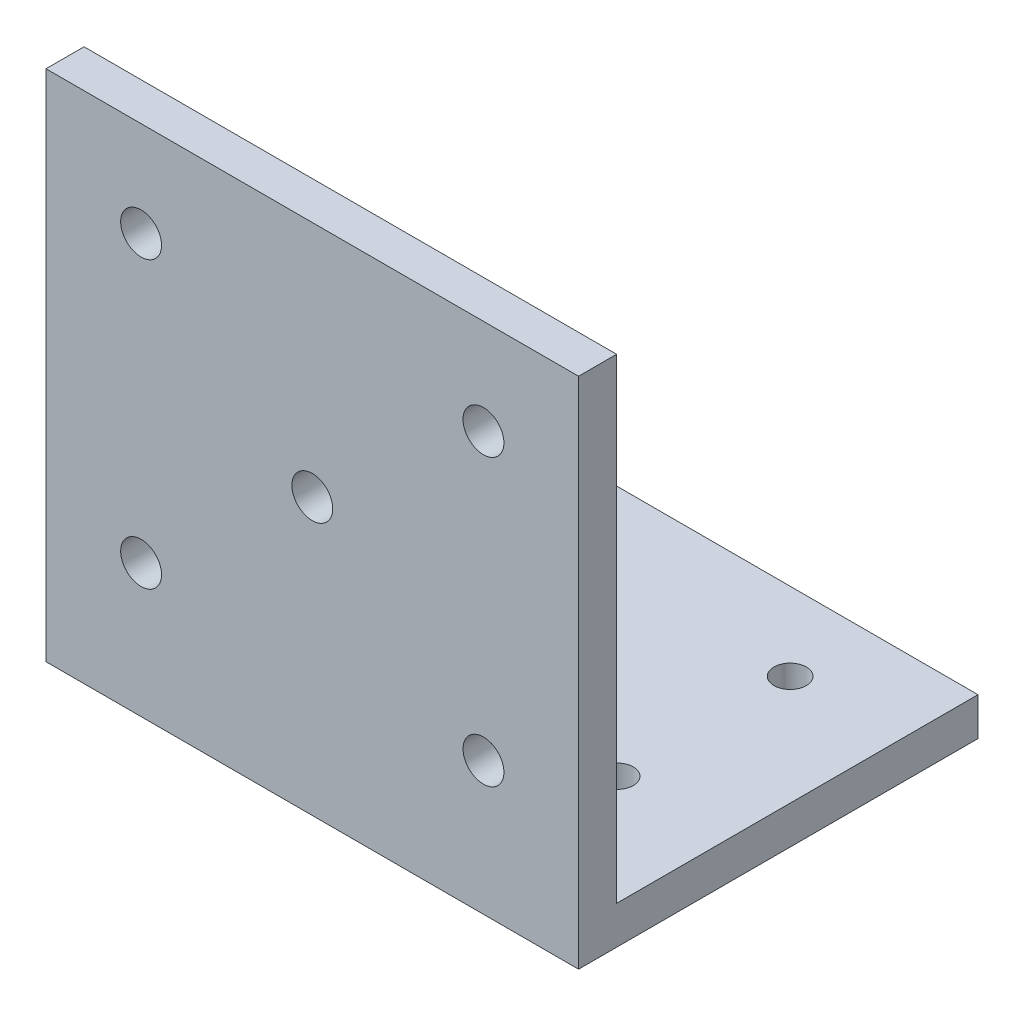
ISO-10303-21;
HEADER;
FILE_DESCRIPTION(('STEP AP214'),'2;1');
FILE_NAME('part.step','',(''),(''),'','','');
FILE_SCHEMA(('AUTOMOTIVE_DESIGN { 1 0 10303 214 1 1 1 1 }'));
ENDSEC;
DATA;
#1=APPLICATION_CONTEXT('core data for automotive mechanical design processes');
#2=APPLICATION_PROTOCOL_DEFINITION('international standard','automotive_design',2000,#1);
#3=PRODUCT_CONTEXT('',#1,'mechanical');
#4=PRODUCT('Part','Part','',(#3));
#5=PRODUCT_RELATED_PRODUCT_CATEGORY('part','',(#4));
#6=PRODUCT_DEFINITION_FORMATION('','',#4);
#7=PRODUCT_DEFINITION_CONTEXT('part definition',#1,'design');
#8=PRODUCT_DEFINITION('design','',#6,#7);
#9=PRODUCT_DEFINITION_SHAPE('','',#8);
#10=(LENGTH_UNIT() NAMED_UNIT(*) SI_UNIT(.MILLI.,.METRE.));
#11=(NAMED_UNIT(*) PLANE_ANGLE_UNIT() SI_UNIT($,.RADIAN.));
#12=(NAMED_UNIT(*) SI_UNIT($,.STERADIAN.) SOLID_ANGLE_UNIT());
#13=UNCERTAINTY_MEASURE_WITH_UNIT(LENGTH_MEASURE(1.E-05),#10,'distance_accuracy_value','');
#14=(GEOMETRIC_REPRESENTATION_CONTEXT(3) GLOBAL_UNCERTAINTY_ASSIGNED_CONTEXT((#13)) GLOBAL_UNIT_ASSIGNED_CONTEXT((#10,
#11,#12)) REPRESENTATION_CONTEXT('',''));
#15=CARTESIAN_POINT('',(0.,0.,0.));
#16=DIRECTION('',(0.,0.,1.));
#17=DIRECTION('',(1.,0.,0.));
#18=AXIS2_PLACEMENT_3D('',#15,#16,#17);
#19=CARTESIAN_POINT('',(0.,0.,0.));
#20=DIRECTION('',(0.,1.,0.));
#21=DIRECTION('',(0.,0.,1.));
#22=AXIS2_PLACEMENT_3D('',#19,#20,#21);
#23=PLANE('',#22);
#24=CARTESIAN_POINT('',(-22.762292358804,0.,-4.59069767441856));
#25=DIRECTION('',(0.,1.,0.));
#26=DIRECTION('',(0.,0.,1.));
#27=AXIS2_PLACEMENT_3D('',#24,#25,#26);
#28=CIRCLE('',#27,1.7);
#29=CARTESIAN_POINT('',(-22.762292358804,0.,-2.89069767441856));
#30=VERTEX_POINT('',#29);
#31=EDGE_CURVE('E285',#30,#30,#28,.T.);
#32=ORIENTED_EDGE('',*,*,#31,.T.);
#33=EDGE_LOOP('',(#32));
#34=FACE_BOUND('',#33,.T.);
#35=CARTESIAN_POINT('',(-14.512292358804,0.,4.50930232558144));
#36=DIRECTION('',(0.,1.,0.));
#37=DIRECTION('',(0.,0.,1.));
#38=AXIS2_PLACEMENT_3D('',#35,#36,#37);
#39=CIRCLE('',#38,7.2);
#40=CARTESIAN_POINT('',(-14.512292358804,0.,11.7093023255814));
#41=VERTEX_POINT('',#40);
#42=EDGE_CURVE('E295',#41,#41,#39,.T.);
#43=ORIENTED_EDGE('',*,*,#42,.T.);
#44=EDGE_LOOP('',(#43));
#45=FACE_BOUND('',#44,.T.);
#46=CARTESIAN_POINT('',(-22.762292358804,0.,13.6093023255814));
#47=DIRECTION('',(0.,1.,0.));
#48=DIRECTION('',(0.,0.,1.));
#49=AXIS2_PLACEMENT_3D('',#46,#47,#48);
#50=CIRCLE('',#49,1.7);
#51=CARTESIAN_POINT('',(-22.762292358804,0.,15.3093023255814));
#52=VERTEX_POINT('',#51);
#53=EDGE_CURVE('E304',#52,#52,#50,.T.);
#54=ORIENTED_EDGE('',*,*,#53,.T.);
#55=EDGE_LOOP('',(#54));
#56=FACE_BOUND('',#55,.T.);
#57=DIRECTION('',(0.,0.,1.));
#58=VECTOR('',#57,1.);
#59=CARTESIAN_POINT('',(21.687707641196,0.,0.));
#60=LINE('',#59,#58);
#61=CARTESIAN_POINT('',(21.687707641196,0.,-12.7906976744186));
#62=VERTEX_POINT('',#61);
#63=CARTESIAN_POINT('',(21.687707641196,0.,29.2093023255814));
#64=VERTEX_POINT('',#63);
#65=EDGE_CURVE('E183',#62,#64,#60,.T.);
#66=ORIENTED_EDGE('',*,*,#65,.T.);
#67=DIRECTION('',(-1.,0.,0.));
#68=VECTOR('',#67,1.);
#69=CARTESIAN_POINT('',(0.,0.,29.2093023255814));
#70=LINE('',#69,#68);
#71=CARTESIAN_POINT('',(-34.312292358804,0.,29.2093023255815));
#72=VERTEX_POINT('',#71);
#73=EDGE_CURVE('E206',#64,#72,#70,.T.);
#74=ORIENTED_EDGE('',*,*,#73,.T.);
#75=DIRECTION('',(0.,0.,-1.));
#76=VECTOR('',#75,1.);
#77=CARTESIAN_POINT('',(-34.312292358804,0.,0.));
#78=LINE('',#77,#76);
#79=CARTESIAN_POINT('',(-34.312292358804,0.,-12.7906976744186));
#80=VERTEX_POINT('',#79);
#81=EDGE_CURVE('E213',#72,#80,#78,.T.);
#82=ORIENTED_EDGE('',*,*,#81,.T.);
#83=DIRECTION('',(1.,0.,0.));
#84=VECTOR('',#83,1.);
#85=CARTESIAN_POINT('',(0.,0.,-12.7906976744186));
#86=LINE('',#85,#84);
#87=EDGE_CURVE('E180',#80,#62,#86,.T.);
#88=ORIENTED_EDGE('',*,*,#87,.T.);
#89=EDGE_LOOP('',(#66,#74,#82,#88));
#90=FACE_BOUND('',#89,.T.);
#91=CARTESIAN_POINT('',(10.137707641196,0.,-4.59069767441856));
#92=DIRECTION('',(0.,1.,0.));
#93=DIRECTION('',(0.,0.,1.));
#94=AXIS2_PLACEMENT_3D('',#91,#92,#93);
#95=CIRCLE('',#94,1.7);
#96=CARTESIAN_POINT('',(10.137707641196,0.,-2.89069767441856));
#97=VERTEX_POINT('',#96);
#98=EDGE_CURVE('E301',#97,#97,#95,.F.);
#99=ORIENTED_EDGE('',*,*,#98,.F.);
#100=EDGE_LOOP('',(#99));
#101=FACE_BOUND('',#100,.T.);
#102=CARTESIAN_POINT('',(10.137707641196,0.,13.6093023255814));
#103=DIRECTION('',(0.,1.,0.));
#104=DIRECTION('',(0.,0.,1.));
#105=AXIS2_PLACEMENT_3D('',#102,#103,#104);
#106=CIRCLE('',#105,1.7);
#107=CARTESIAN_POINT('',(10.137707641196,0.,15.3093023255814));
#108=VERTEX_POINT('',#107);
#109=EDGE_CURVE('E298',#108,#108,#106,.F.);
#110=ORIENTED_EDGE('',*,*,#109,.F.);
#111=EDGE_LOOP('',(#110));
#112=FACE_BOUND('',#111,.T.);
#113=ADVANCED_FACE('F114',(#34,#45,#56,#90,#101,#112),#23,.F.);
#114=CARTESIAN_POINT('',(0.,4.,0.));
#115=DIRECTION('',(0.,1.,0.));
#116=DIRECTION('',(0.,0.,1.));
#117=AXIS2_PLACEMENT_3D('',#114,#115,#116);
#118=PLANE('',#117);
#119=CARTESIAN_POINT('',(-22.762292358804,4.,-4.59069767441856));
#120=DIRECTION('',(0.,1.,0.));
#121=DIRECTION('',(0.,0.,1.));
#122=AXIS2_PLACEMENT_3D('',#119,#120,#121);
#123=CIRCLE('',#122,1.7);
#124=CARTESIAN_POINT('',(-22.762292358804,4.,-2.89069767441856));
#125=VERTEX_POINT('',#124);
#126=EDGE_CURVE('E311',#125,#125,#123,.T.);
#127=ORIENTED_EDGE('',*,*,#126,.F.);
#128=EDGE_LOOP('',(#127));
#129=FACE_BOUND('',#128,.T.);
#130=CARTESIAN_POINT('',(-14.512292358804,4.,4.50930232558144));
#131=DIRECTION('',(0.,1.,0.));
#132=DIRECTION('',(0.,0.,1.));
#133=AXIS2_PLACEMENT_3D('',#130,#131,#132);
#134=CIRCLE('',#133,7.2);
#135=CARTESIAN_POINT('',(-14.512292358804,4.,11.7093023255814));
#136=VERTEX_POINT('',#135);
#137=EDGE_CURVE('E314',#136,#136,#134,.T.);
#138=ORIENTED_EDGE('',*,*,#137,.F.);
#139=EDGE_LOOP('',(#138));
#140=FACE_BOUND('',#139,.T.);
#141=CARTESIAN_POINT('',(10.137707641196,4.,-4.59069767441856));
#142=DIRECTION('',(0.,1.,0.));
#143=DIRECTION('',(0.,0.,1.));
#144=AXIS2_PLACEMENT_3D('',#141,#142,#143);
#145=CIRCLE('',#144,1.7);
#146=CARTESIAN_POINT('',(10.137707641196,4.,-2.89069767441856));
#147=VERTEX_POINT('',#146);
#148=EDGE_CURVE('E310',#147,#147,#145,.F.);
#149=ORIENTED_EDGE('',*,*,#148,.T.);
#150=EDGE_LOOP('',(#149));
#151=FACE_BOUND('',#150,.T.);
#152=CARTESIAN_POINT('',(-22.762292358804,4.,13.6093023255814));
#153=DIRECTION('',(0.,1.,0.));
#154=DIRECTION('',(0.,0.,1.));
#155=AXIS2_PLACEMENT_3D('',#152,#153,#154);
#156=CIRCLE('',#155,1.7);
#157=CARTESIAN_POINT('',(-22.762292358804,4.,15.3093023255814));
#158=VERTEX_POINT('',#157);
#159=EDGE_CURVE('E307',#158,#158,#156,.T.);
#160=ORIENTED_EDGE('',*,*,#159,.F.);
#161=EDGE_LOOP('',(#160));
#162=FACE_BOUND('',#161,.T.);
#163=DIRECTION('',(1.,0.,0.));
#164=VECTOR('',#163,1.);
#165=CARTESIAN_POINT('',(0.,4.,-12.7906976744186));
#166=LINE('',#165,#164);
#167=CARTESIAN_POINT('',(-34.312292358804,4.,-12.7906976744186));
#168=VERTEX_POINT('',#167);
#169=CARTESIAN_POINT('',(21.687707641196,4.,-12.7906976744186));
#170=VERTEX_POINT('',#169);
#171=EDGE_CURVE('E177',#168,#170,#166,.T.);
#172=ORIENTED_EDGE('',*,*,#171,.F.);
#173=DIRECTION('',(0.,0.,-1.));
#174=VECTOR('',#173,1.);
#175=CARTESIAN_POINT('',(-34.312292358804,4.,0.));
#176=LINE('',#175,#174);
#177=CARTESIAN_POINT('',(-34.312292358804,4.,25.2093023255815));
#178=VERTEX_POINT('',#177);
#179=EDGE_CURVE('E129',#178,#168,#176,.T.);
#180=ORIENTED_EDGE('',*,*,#179,.F.);
#181=DIRECTION('',(-1.,0.,0.));
#182=VECTOR('',#181,1.);
#183=CARTESIAN_POINT('',(0.,4.,25.2093023255815));
#184=LINE('',#183,#182);
#185=CARTESIAN_POINT('',(21.687707641196,4.,25.2093023255815));
#186=VERTEX_POINT('',#185);
#187=EDGE_CURVE('E194',#186,#178,#184,.T.);
#188=ORIENTED_EDGE('',*,*,#187,.F.);
#189=DIRECTION('',(0.,0.,1.));
#190=VECTOR('',#189,1.);
#191=CARTESIAN_POINT('',(21.687707641196,4.,0.));
#192=LINE('',#191,#190);
#193=EDGE_CURVE('E188',#170,#186,#192,.T.);
#194=ORIENTED_EDGE('',*,*,#193,.F.);
#195=EDGE_LOOP('',(#172,#180,#188,#194));
#196=FACE_BOUND('',#195,.T.);
#197=CARTESIAN_POINT('',(10.137707641196,4.,13.6093023255814));
#198=DIRECTION('',(0.,1.,0.));
#199=DIRECTION('',(0.,0.,1.));
#200=AXIS2_PLACEMENT_3D('',#197,#198,#199);
#201=CIRCLE('',#200,1.7);
#202=CARTESIAN_POINT('',(10.137707641196,4.,15.3093023255814));
#203=VERTEX_POINT('',#202);
#204=EDGE_CURVE('E317',#203,#203,#201,.F.);
#205=ORIENTED_EDGE('',*,*,#204,.T.);
#206=EDGE_LOOP('',(#205));
#207=FACE_BOUND('',#206,.T.);
#208=ADVANCED_FACE('F186',(#129,#140,#151,#162,#196,#207),#118,.T.);
#209=CARTESIAN_POINT('',(0.,54.,25.2093023255815));
#210=DIRECTION('',(0.,0.,1.));
#211=DIRECTION('',(1.,0.,0.));
#212=AXIS2_PLACEMENT_3D('',#209,#210,#211);
#213=PLANE('',#212);
#214=CARTESIAN_POINT('',(-24.312292358804,14.,25.2093023255815));
#215=DIRECTION('',(0.,0.,-1.));
#216=DIRECTION('',(-1.,0.,0.));
#217=AXIS2_PLACEMENT_3D('',#214,#215,#216);
#218=CIRCLE('',#217,2.15);
#219=CARTESIAN_POINT('',(-26.462292358804,14.,25.2093023255815));
#220=VERTEX_POINT('',#219);
#221=EDGE_CURVE('E260',#220,#220,#218,.T.);
#222=ORIENTED_EDGE('',*,*,#221,.F.);
#223=EDGE_LOOP('',(#222));
#224=FACE_BOUND('',#223,.T.);
#225=CARTESIAN_POINT('',(-24.312292358804,44.,25.2093023255815));
#226=DIRECTION('',(0.,0.,1.));
#227=DIRECTION('',(1.,0.,0.));
#228=AXIS2_PLACEMENT_3D('',#225,#226,#227);
#229=CIRCLE('',#228,2.15);
#230=CARTESIAN_POINT('',(-22.162292358804,44.,25.2093023255815));
#231=VERTEX_POINT('',#230);
#232=EDGE_CURVE('E263',#231,#231,#229,.T.);
#233=ORIENTED_EDGE('',*,*,#232,.T.);
#234=EDGE_LOOP('',(#233));
#235=FACE_BOUND('',#234,.T.);
#236=DIRECTION('',(0.,-1.,0.));
#237=VECTOR('',#236,1.);
#238=CARTESIAN_POINT('',(21.687707641196,54.,25.2093023255815));
#239=LINE('',#238,#237);
#240=CARTESIAN_POINT('',(21.687707641196,54.,25.2093023255815));
#241=VERTEX_POINT('',#240);
#242=EDGE_CURVE('E12',#241,#186,#239,.T.);
#243=ORIENTED_EDGE('',*,*,#242,.T.);
#244=ORIENTED_EDGE('',*,*,#187,.T.);
#245=DIRECTION('',(0.,-1.,0.));
#246=VECTOR('',#245,1.);
#247=CARTESIAN_POINT('',(-34.312292358804,54.,25.2093023255815));
#248=LINE('',#247,#246);
#249=CARTESIAN_POINT('',(-34.312292358804,54.,25.2093023255815));
#250=VERTEX_POINT('',#249);
#251=EDGE_CURVE('E122',#250,#178,#248,.T.);
#252=ORIENTED_EDGE('',*,*,#251,.F.);
#253=DIRECTION('',(-1.,0.,0.));
#254=VECTOR('',#253,1.);
#255=CARTESIAN_POINT('',(0.,54.,25.2093023255815));
#256=LINE('',#255,#254);
#257=EDGE_CURVE('E205',#241,#250,#256,.T.);
#258=ORIENTED_EDGE('',*,*,#257,.F.);
#259=EDGE_LOOP('',(#243,#244,#252,#258));
#260=FACE_BOUND('',#259,.T.);
#261=CARTESIAN_POINT('',(11.687707641196,14.,25.2093023255815));
#262=DIRECTION('',(0.,0.,-1.));
#263=DIRECTION('',(-1.,0.,0.));
#264=AXIS2_PLACEMENT_3D('',#261,#262,#263);
#265=CIRCLE('',#264,2.15);
#266=CARTESIAN_POINT('',(9.53770764119601,14.,25.2093023255815));
#267=VERTEX_POINT('',#266);
#268=EDGE_CURVE('E287',#267,#267,#265,.F.);
#269=ORIENTED_EDGE('',*,*,#268,.T.);
#270=EDGE_LOOP('',(#269));
#271=FACE_BOUND('',#270,.T.);
#272=CARTESIAN_POINT('',(11.687707641196,44.,25.2093023255815));
#273=DIRECTION('',(0.,0.,-1.));
#274=DIRECTION('',(-1.,0.,0.));
#275=AXIS2_PLACEMENT_3D('',#272,#273,#274);
#276=CIRCLE('',#275,2.15);
#277=CARTESIAN_POINT('',(9.53770764119601,44.,25.2093023255815));
#278=VERTEX_POINT('',#277);
#279=EDGE_CURVE('E269',#278,#278,#276,.T.);
#280=ORIENTED_EDGE('',*,*,#279,.F.);
#281=EDGE_LOOP('',(#280));
#282=FACE_BOUND('',#281,.T.);
#283=CARTESIAN_POINT('',(-6.31229235880399,29.,25.2093023255815));
#284=DIRECTION('',(0.,0.,-1.));
#285=DIRECTION('',(-1.,0.,0.));
#286=AXIS2_PLACEMENT_3D('',#283,#284,#285);
#287=CIRCLE('',#286,2.15);
#288=CARTESIAN_POINT('',(-8.46229235880399,29.,25.2093023255815));
#289=VERTEX_POINT('',#288);
#290=EDGE_CURVE('E279',#289,#289,#287,.T.);
#291=ORIENTED_EDGE('',*,*,#290,.F.);
#292=EDGE_LOOP('',(#291));
#293=FACE_BOUND('',#292,.T.);
#294=ADVANCED_FACE('F226',(#224,#235,#260,#271,#282,#293),#213,.F.);
#295=CARTESIAN_POINT('',(0.,54.,29.2093023255814));
#296=DIRECTION('',(0.,0.,1.));
#297=DIRECTION('',(1.,0.,0.));
#298=AXIS2_PLACEMENT_3D('',#295,#296,#297);
#299=PLANE('',#298);
#300=CARTESIAN_POINT('',(-24.312292358804,44.,29.2093023255815));
#301=DIRECTION('',(0.,0.,1.));
#302=DIRECTION('',(1.,0.,0.));
#303=AXIS2_PLACEMENT_3D('',#300,#301,#302);
#304=CIRCLE('',#303,2.15);
#305=CARTESIAN_POINT('',(-22.162292358804,44.,29.2093023255815));
#306=VERTEX_POINT('',#305);
#307=EDGE_CURVE('E266',#306,#306,#304,.T.);
#308=ORIENTED_EDGE('',*,*,#307,.F.);
#309=EDGE_LOOP('',(#308));
#310=FACE_BOUND('',#309,.T.);
#311=CARTESIAN_POINT('',(11.687707641196,14.,29.2093023255815));
#312=DIRECTION('',(0.,0.,-1.));
#313=DIRECTION('',(-1.,0.,0.));
#314=AXIS2_PLACEMENT_3D('',#311,#312,#313);
#315=CIRCLE('',#314,2.15);
#316=CARTESIAN_POINT('',(9.53770764119601,14.,29.2093023255815));
#317=VERTEX_POINT('',#316);
#318=EDGE_CURVE('E201',#317,#317,#315,.F.);
#319=ORIENTED_EDGE('',*,*,#318,.F.);
#320=EDGE_LOOP('',(#319));
#321=FACE_BOUND('',#320,.T.);
#322=ORIENTED_EDGE('',*,*,#73,.F.);
#323=DIRECTION('',(0.,-1.,0.));
#324=VECTOR('',#323,1.);
#325=CARTESIAN_POINT('',(21.687707641196,54.,29.2093023255814));
#326=LINE('',#325,#324);
#327=CARTESIAN_POINT('',(21.687707641196,54.,29.2093023255814));
#328=VERTEX_POINT('',#327);
#329=EDGE_CURVE('E138',#328,#64,#326,.T.);
#330=ORIENTED_EDGE('',*,*,#329,.F.);
#331=DIRECTION('',(-1.,0.,0.));
#332=VECTOR('',#331,1.);
#333=CARTESIAN_POINT('',(0.,54.,29.2093023255814));
#334=LINE('',#333,#332);
#335=CARTESIAN_POINT('',(-34.312292358804,54.,29.2093023255815));
#336=VERTEX_POINT('',#335);
#337=EDGE_CURVE('E210',#328,#336,#334,.T.);
#338=ORIENTED_EDGE('',*,*,#337,.T.);
#339=DIRECTION('',(0.,-1.,0.));
#340=VECTOR('',#339,1.);
#341=CARTESIAN_POINT('',(-34.312292358804,54.,29.2093023255815));
#342=LINE('',#341,#340);
#343=EDGE_CURVE('E218',#336,#72,#342,.T.);
#344=ORIENTED_EDGE('',*,*,#343,.T.);
#345=EDGE_LOOP('',(#322,#330,#338,#344));
#346=FACE_BOUND('',#345,.T.);
#347=CARTESIAN_POINT('',(11.687707641196,44.,29.2093023255815));
#348=DIRECTION('',(0.,0.,-1.));
#349=DIRECTION('',(-1.,0.,0.));
#350=AXIS2_PLACEMENT_3D('',#347,#348,#349);
#351=CIRCLE('',#350,2.15);
#352=CARTESIAN_POINT('',(9.53770764119601,44.,29.2093023255815));
#353=VERTEX_POINT('',#352);
#354=EDGE_CURVE('E265',#353,#353,#351,.T.);
#355=ORIENTED_EDGE('',*,*,#354,.T.);
#356=EDGE_LOOP('',(#355));
#357=FACE_BOUND('',#356,.T.);
#358=CARTESIAN_POINT('',(-24.312292358804,14.,29.2093023255815));
#359=DIRECTION('',(0.,0.,-1.));
#360=DIRECTION('',(-1.,0.,0.));
#361=AXIS2_PLACEMENT_3D('',#358,#359,#360);
#362=CIRCLE('',#361,2.15);
#363=CARTESIAN_POINT('',(-26.462292358804,14.,29.2093023255815));
#364=VERTEX_POINT('',#363);
#365=EDGE_CURVE('E276',#364,#364,#362,.T.);
#366=ORIENTED_EDGE('',*,*,#365,.T.);
#367=EDGE_LOOP('',(#366));
#368=FACE_BOUND('',#367,.T.);
#369=CARTESIAN_POINT('',(-6.31229235880399,29.,29.2093023255815));
#370=DIRECTION('',(0.,0.,-1.));
#371=DIRECTION('',(-1.,0.,0.));
#372=AXIS2_PLACEMENT_3D('',#369,#370,#371);
#373=CIRCLE('',#372,2.15);
#374=CARTESIAN_POINT('',(-8.46229235880399,29.,29.2093023255815));
#375=VERTEX_POINT('',#374);
#376=EDGE_CURVE('E282',#375,#375,#373,.T.);
#377=ORIENTED_EDGE('',*,*,#376,.T.);
#378=EDGE_LOOP('',(#377));
#379=FACE_BOUND('',#378,.T.);
#380=ADVANCED_FACE('F219',(#310,#321,#346,#357,#368,#379),#299,.T.);
#381=CARTESIAN_POINT('',(21.687707641196,54.,0.));
#382=DIRECTION('',(1.,0.,0.));
#383=DIRECTION('',(0.,0.,-1.));
#384=AXIS2_PLACEMENT_3D('',#381,#382,#383);
#385=PLANE('',#384);
#386=ORIENTED_EDGE('',*,*,#65,.F.);
#387=DIRECTION('',(0.,-1.,0.));
#388=VECTOR('',#387,1.);
#389=CARTESIAN_POINT('',(21.687707641196,4.,-12.7906976744186));
#390=LINE('',#389,#388);
#391=EDGE_CURVE('E184',#170,#62,#390,.T.);
#392=ORIENTED_EDGE('',*,*,#391,.F.);
#393=ORIENTED_EDGE('',*,*,#193,.T.);
#394=ORIENTED_EDGE('',*,*,#242,.F.);
#395=DIRECTION('',(0.,0.,1.));
#396=VECTOR('',#395,1.);
#397=CARTESIAN_POINT('',(21.687707641196,54.,0.));
#398=LINE('',#397,#396);
#399=EDGE_CURVE('E203',#241,#328,#398,.T.);
#400=ORIENTED_EDGE('',*,*,#399,.T.);
#401=ORIENTED_EDGE('',*,*,#329,.T.);
#402=EDGE_LOOP('',(#386,#392,#393,#394,#400,#401));
#403=FACE_BOUND('',#402,.T.);
#404=ADVANCED_FACE('F116',(#403),#385,.T.);
#405=CARTESIAN_POINT('',(-34.312292358804,54.,0.));
#406=DIRECTION('',(-1.,0.,0.));
#407=DIRECTION('',(0.,0.,1.));
#408=AXIS2_PLACEMENT_3D('',#405,#406,#407);
#409=PLANE('',#408);
#410=ORIENTED_EDGE('',*,*,#81,.F.);
#411=ORIENTED_EDGE('',*,*,#343,.F.);
#412=DIRECTION('',(0.,0.,-1.));
#413=VECTOR('',#412,1.);
#414=CARTESIAN_POINT('',(-34.312292358804,54.,0.));
#415=LINE('',#414,#413);
#416=EDGE_CURVE('E208',#336,#250,#415,.T.);
#417=ORIENTED_EDGE('',*,*,#416,.T.);
#418=ORIENTED_EDGE('',*,*,#251,.T.);
#419=ORIENTED_EDGE('',*,*,#179,.T.);
#420=DIRECTION('',(0.,-1.,0.));
#421=VECTOR('',#420,1.);
#422=CARTESIAN_POINT('',(-34.312292358804,4.,-12.7906976744186));
#423=LINE('',#422,#421);
#424=EDGE_CURVE('E174',#168,#80,#423,.T.);
#425=ORIENTED_EDGE('',*,*,#424,.T.);
#426=EDGE_LOOP('',(#410,#411,#417,#418,#419,#425));
#427=FACE_BOUND('',#426,.T.);
#428=ADVANCED_FACE('F191',(#427),#409,.T.);
#429=CARTESIAN_POINT('',(0.,54.,0.));
#430=DIRECTION('',(0.,1.,0.));
#431=DIRECTION('',(0.,0.,1.));
#432=AXIS2_PLACEMENT_3D('',#429,#430,#431);
#433=PLANE('',#432);
#434=ORIENTED_EDGE('',*,*,#399,.F.);
#435=ORIENTED_EDGE('',*,*,#257,.T.);
#436=ORIENTED_EDGE('',*,*,#416,.F.);
#437=ORIENTED_EDGE('',*,*,#337,.F.);
#438=EDGE_LOOP('',(#434,#435,#436,#437));
#439=FACE_BOUND('',#438,.T.);
#440=ADVANCED_FACE('F230',(#439),#433,.T.);
#441=CARTESIAN_POINT('',(0.,4.,-12.7906976744186));
#442=DIRECTION('',(0.,0.,-1.));
#443=DIRECTION('',(-1.,0.,0.));
#444=AXIS2_PLACEMENT_3D('',#441,#442,#443);
#445=PLANE('',#444);
#446=ORIENTED_EDGE('',*,*,#87,.F.);
#447=ORIENTED_EDGE('',*,*,#424,.F.);
#448=ORIENTED_EDGE('',*,*,#171,.T.);
#449=ORIENTED_EDGE('',*,*,#391,.T.);
#450=EDGE_LOOP('',(#446,#447,#448,#449));
#451=FACE_BOUND('',#450,.T.);
#452=ADVANCED_FACE('F175',(#451),#445,.T.);
#453=CARTESIAN_POINT('',(11.687707641196,14.,29.2093023255815));
#454=DIRECTION('',(0.,0.,-1.));
#455=DIRECTION('',(-1.,0.,0.));
#456=AXIS2_PLACEMENT_3D('',#453,#454,#455);
#457=CYLINDRICAL_SURFACE('',#456,2.15);
#458=ORIENTED_EDGE('',*,*,#318,.T.);
#459=EDGE_LOOP('',(#458));
#460=FACE_BOUND('',#459,.T.);
#461=ORIENTED_EDGE('',*,*,#268,.F.);
#462=EDGE_LOOP('',(#461));
#463=FACE_BOUND('',#462,.T.);
#464=ADVANCED_FACE('F237',(#460,#463),#457,.F.);
#465=CARTESIAN_POINT('',(11.687707641196,44.,29.2093023255815));
#466=DIRECTION('',(0.,0.,-1.));
#467=DIRECTION('',(-1.,0.,0.));
#468=AXIS2_PLACEMENT_3D('',#465,#466,#467);
#469=CYLINDRICAL_SURFACE('',#468,2.15);
#470=ORIENTED_EDGE('',*,*,#354,.F.);
#471=EDGE_LOOP('',(#470));
#472=FACE_BOUND('',#471,.T.);
#473=ORIENTED_EDGE('',*,*,#279,.T.);
#474=EDGE_LOOP('',(#473));
#475=FACE_BOUND('',#474,.T.);
#476=ADVANCED_FACE('F354',(#472,#475),#469,.F.);
#477=CARTESIAN_POINT('',(-24.312292358804,44.,29.2093023255815));
#478=DIRECTION('',(0.,0.,-1.));
#479=DIRECTION('',(-1.,0.,0.));
#480=AXIS2_PLACEMENT_3D('',#477,#478,#479);
#481=CYLINDRICAL_SURFACE('',#480,2.15);
#482=ORIENTED_EDGE('',*,*,#307,.T.);
#483=EDGE_LOOP('',(#482));
#484=FACE_BOUND('',#483,.T.);
#485=ORIENTED_EDGE('',*,*,#232,.F.);
#486=EDGE_LOOP('',(#485));
#487=FACE_BOUND('',#486,.T.);
#488=ADVANCED_FACE('F357',(#484,#487),#481,.F.);
#489=CARTESIAN_POINT('',(-24.312292358804,14.,29.2093023255815));
#490=DIRECTION('',(0.,0.,-1.));
#491=DIRECTION('',(-1.,0.,0.));
#492=AXIS2_PLACEMENT_3D('',#489,#490,#491);
#493=CYLINDRICAL_SURFACE('',#492,2.15);
#494=ORIENTED_EDGE('',*,*,#365,.F.);
#495=EDGE_LOOP('',(#494));
#496=FACE_BOUND('',#495,.T.);
#497=ORIENTED_EDGE('',*,*,#221,.T.);
#498=EDGE_LOOP('',(#497));
#499=FACE_BOUND('',#498,.T.);
#500=ADVANCED_FACE('F361',(#496,#499),#493,.F.);
#501=CARTESIAN_POINT('',(-6.31229235880399,29.,29.2093023255815));
#502=DIRECTION('',(0.,0.,-1.));
#503=DIRECTION('',(-1.,0.,0.));
#504=AXIS2_PLACEMENT_3D('',#501,#502,#503);
#505=CYLINDRICAL_SURFACE('',#504,2.15);
#506=ORIENTED_EDGE('',*,*,#376,.F.);
#507=EDGE_LOOP('',(#506));
#508=FACE_BOUND('',#507,.T.);
#509=ORIENTED_EDGE('',*,*,#290,.T.);
#510=EDGE_LOOP('',(#509));
#511=FACE_BOUND('',#510,.T.);
#512=ADVANCED_FACE('F352',(#508,#511),#505,.F.);
#513=CARTESIAN_POINT('',(-22.762292358804,-6.,13.6093023255814));
#514=DIRECTION('',(0.,1.,0.));
#515=DIRECTION('',(0.,0.,1.));
#516=AXIS2_PLACEMENT_3D('',#513,#514,#515);
#517=CYLINDRICAL_SURFACE('',#516,1.7);
#518=ORIENTED_EDGE('',*,*,#159,.T.);
#519=EDGE_LOOP('',(#518));
#520=FACE_BOUND('',#519,.T.);
#521=ORIENTED_EDGE('',*,*,#53,.F.);
#522=EDGE_LOOP('',(#521));
#523=FACE_BOUND('',#522,.T.);
#524=ADVANCED_FACE('F329',(#520,#523),#517,.F.);
#525=CARTESIAN_POINT('',(10.137707641196,-6.,-4.59069767441856));
#526=DIRECTION('',(0.,1.,0.));
#527=DIRECTION('',(0.,0.,1.));
#528=AXIS2_PLACEMENT_3D('',#525,#526,#527);
#529=CYLINDRICAL_SURFACE('',#528,1.7);
#530=ORIENTED_EDGE('',*,*,#148,.F.);
#531=EDGE_LOOP('',(#530));
#532=FACE_BOUND('',#531,.T.);
#533=ORIENTED_EDGE('',*,*,#98,.T.);
#534=EDGE_LOOP('',(#533));
#535=FACE_BOUND('',#534,.T.);
#536=ADVANCED_FACE('F325',(#532,#535),#529,.F.);
#537=CARTESIAN_POINT('',(10.137707641196,-6.,13.6093023255814));
#538=DIRECTION('',(0.,1.,0.));
#539=DIRECTION('',(0.,0.,1.));
#540=AXIS2_PLACEMENT_3D('',#537,#538,#539);
#541=CYLINDRICAL_SURFACE('',#540,1.7);
#542=ORIENTED_EDGE('',*,*,#204,.F.);
#543=EDGE_LOOP('',(#542));
#544=FACE_BOUND('',#543,.T.);
#545=ORIENTED_EDGE('',*,*,#109,.T.);
#546=EDGE_LOOP('',(#545));
#547=FACE_BOUND('',#546,.T.);
#548=ADVANCED_FACE('F328',(#544,#547),#541,.F.);
#549=CARTESIAN_POINT('',(-14.512292358804,-6.,4.50930232558144));
#550=DIRECTION('',(0.,1.,0.));
#551=DIRECTION('',(0.,0.,1.));
#552=AXIS2_PLACEMENT_3D('',#549,#550,#551);
#553=CYLINDRICAL_SURFACE('',#552,7.2);
#554=ORIENTED_EDGE('',*,*,#137,.T.);
#555=EDGE_LOOP('',(#554));
#556=FACE_BOUND('',#555,.T.);
#557=ORIENTED_EDGE('',*,*,#42,.F.);
#558=EDGE_LOOP('',(#557));
#559=FACE_BOUND('',#558,.T.);
#560=ADVANCED_FACE('F336',(#556,#559),#553,.F.);
#561=CARTESIAN_POINT('',(-22.762292358804,-6.,-4.59069767441856));
#562=DIRECTION('',(0.,1.,0.));
#563=DIRECTION('',(0.,0.,1.));
#564=AXIS2_PLACEMENT_3D('',#561,#562,#563);
#565=CYLINDRICAL_SURFACE('',#564,1.7);
#566=ORIENTED_EDGE('',*,*,#126,.T.);
#567=EDGE_LOOP('',(#566));
#568=FACE_BOUND('',#567,.T.);
#569=ORIENTED_EDGE('',*,*,#31,.F.);
#570=EDGE_LOOP('',(#569));
#571=FACE_BOUND('',#570,.T.);
#572=ADVANCED_FACE('F342',(#568,#571),#565,.F.);
#573=CLOSED_SHELL('',(#113,#208,#294,#380,#404,#428,#440,#452,#464,#476,#488,#500,#512,#524,
#536,#548,#560,#572));
#574=MANIFOLD_SOLID_BREP('B2',#573);
#575=ADVANCED_BREP_SHAPE_REPRESENTATION('',(#18,#574),#14);
#576=SHAPE_DEFINITION_REPRESENTATION(#9,#575);
ENDSEC;
END-ISO-10303-21;
